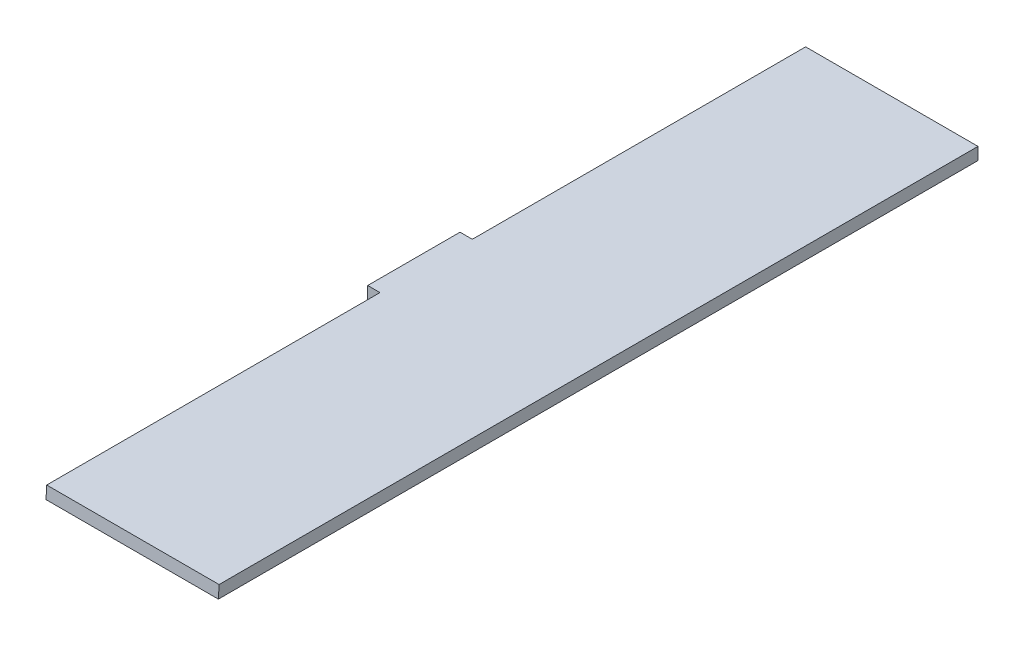
ISO-10303-21;
HEADER;
FILE_DESCRIPTION(('STEP AP214'),'2;1');
FILE_NAME('part.step','',(''),(''),'','','');
FILE_SCHEMA(('AUTOMOTIVE_DESIGN { 1 0 10303 214 1 1 1 1 }'));
ENDSEC;
DATA;
#1=APPLICATION_CONTEXT('core data for automotive mechanical design processes');
#2=APPLICATION_PROTOCOL_DEFINITION('international standard','automotive_design',2000,#1);
#3=PRODUCT_CONTEXT('',#1,'mechanical');
#4=PRODUCT('Part','Part','',(#3));
#5=PRODUCT_RELATED_PRODUCT_CATEGORY('part','',(#4));
#6=PRODUCT_DEFINITION_FORMATION('','',#4);
#7=PRODUCT_DEFINITION_CONTEXT('part definition',#1,'design');
#8=PRODUCT_DEFINITION('design','',#6,#7);
#9=PRODUCT_DEFINITION_SHAPE('','',#8);
#10=(LENGTH_UNIT() NAMED_UNIT(*) SI_UNIT(.MILLI.,.METRE.));
#11=(NAMED_UNIT(*) PLANE_ANGLE_UNIT() SI_UNIT($,.RADIAN.));
#12=(NAMED_UNIT(*) SI_UNIT($,.STERADIAN.) SOLID_ANGLE_UNIT());
#13=UNCERTAINTY_MEASURE_WITH_UNIT(LENGTH_MEASURE(1.E-05),#10,'distance_accuracy_value','');
#14=(GEOMETRIC_REPRESENTATION_CONTEXT(3) GLOBAL_UNCERTAINTY_ASSIGNED_CONTEXT((#13)) GLOBAL_UNIT_ASSIGNED_CONTEXT((#10,
#11,#12)) REPRESENTATION_CONTEXT('',''));
#15=CARTESIAN_POINT('',(0.,0.,0.));
#16=DIRECTION('',(0.,0.,1.));
#17=DIRECTION('',(1.,0.,0.));
#18=AXIS2_PLACEMENT_3D('',#15,#16,#17);
#19=CARTESIAN_POINT('',(-498.,-52.0000000000001,900.));
#20=DIRECTION('',(1.,0.,0.));
#21=DIRECTION('',(0.,0.,-1.));
#22=AXIS2_PLACEMENT_3D('',#19,#20,#21);
#23=PLANE('',#22);
#24=DIRECTION('',(0.,1.,0.));
#25=VECTOR('',#24,1.);
#26=CARTESIAN_POINT('',(-498.,-152.,-104.860222543824));
#27=LINE('',#26,#25);
#28=CARTESIAN_POINT('',(-498.,-152.,-104.860222543824));
#29=VERTEX_POINT('',#28);
#30=CARTESIAN_POINT('',(-498.,-150.,-104.860222543824));
#31=VERTEX_POINT('',#30);
#32=EDGE_CURVE('E139',#29,#31,#27,.T.);
#33=ORIENTED_EDGE('',*,*,#32,.F.);
#34=DIRECTION('',(0.,0.,-1.));
#35=VECTOR('',#34,1.);
#36=CARTESIAN_POINT('',(-498.,-152.,900.));
#37=LINE('',#36,#35);
#38=CARTESIAN_POINT('',(-498.,-152.,-50.6057487484722));
#39=VERTEX_POINT('',#38);
#40=EDGE_CURVE('E11',#39,#29,#37,.T.);
#41=ORIENTED_EDGE('',*,*,#40,.F.);
#42=DIRECTION('',(0.,-0.998359638745861,0.0572540978728565));
#43=VECTOR('',#42,1.);
#44=CARTESIAN_POINT('',(-498.,-106.664599325717,-53.2056509946921));
#45=LINE('',#44,#43);
#46=CARTESIAN_POINT('',(-498.,-150.,-50.7204450876487));
#47=VERTEX_POINT('',#46);
#48=EDGE_CURVE('E157',#47,#39,#45,.T.);
#49=ORIENTED_EDGE('',*,*,#48,.F.);
#50=DIRECTION('',(0.,0.,-1.));
#51=VECTOR('',#50,1.);
#52=CARTESIAN_POINT('',(-498.,-150.,-149.));
#53=LINE('',#52,#51);
#54=EDGE_CURVE('E46',#47,#31,#53,.T.);
#55=ORIENTED_EDGE('',*,*,#54,.T.);
#56=EDGE_LOOP('',(#33,#41,#49,#55));
#57=FACE_BOUND('',#56,.T.);
#58=ADVANCED_FACE('F42',(#57),#23,.F.);
#59=CARTESIAN_POINT('',(-498.,-152.,-119.860222543824));
#60=VERTEX_POINT('',#59);
#61=CARTESIAN_POINT('',(-498.,-152.,-174.));
#62=VERTEX_POINT('',#61);
#63=EDGE_CURVE('E51',#60,#62,#37,.T.);
#64=ORIENTED_EDGE('',*,*,#63,.F.);
#65=DIRECTION('',(0.,1.,0.));
#66=VECTOR('',#65,1.);
#67=CARTESIAN_POINT('',(-498.,-152.,-119.860222543824));
#68=LINE('',#67,#66);
#69=CARTESIAN_POINT('',(-498.,-150.,-119.860222543824));
#70=VERTEX_POINT('',#69);
#71=EDGE_CURVE('E128',#60,#70,#68,.T.);
#72=ORIENTED_EDGE('',*,*,#71,.T.);
#73=CARTESIAN_POINT('',(-498.,-150.,-174.));
#74=VERTEX_POINT('',#73);
#75=EDGE_CURVE('E165',#70,#74,#53,.T.);
#76=ORIENTED_EDGE('',*,*,#75,.T.);
#77=DIRECTION('',(0.,-1.,0.));
#78=VECTOR('',#77,1.);
#79=CARTESIAN_POINT('',(-498.,-203.,-174.));
#80=LINE('',#79,#78);
#81=EDGE_CURVE('E145',#74,#62,#80,.T.);
#82=ORIENTED_EDGE('',*,*,#81,.T.);
#83=EDGE_LOOP('',(#64,#72,#76,#82));
#84=FACE_BOUND('',#83,.T.);
#85=ADVANCED_FACE('F174',(#84),#23,.F.);
#86=CARTESIAN_POINT('',(-500.01,-150.,-50.7204450876487));
#87=DIRECTION('',(0.,0.0572540978728565,0.998359638745861));
#88=DIRECTION('',(0.,-0.998359638745861,0.0572540978728565));
#89=AXIS2_PLACEMENT_3D('',#86,#87,#88);
#90=PLANE('',#89);
#91=DIRECTION('',(-1.,0.,0.));
#92=VECTOR('',#91,1.);
#93=CARTESIAN_POINT('',(-498.,-150.,-50.7204450876487));
#94=LINE('',#93,#92);
#95=CARTESIAN_POINT('',(-470.,-150.,-50.7204450876487));
#96=VERTEX_POINT('',#95);
#97=EDGE_CURVE('E138',#96,#47,#94,.T.);
#98=ORIENTED_EDGE('',*,*,#97,.T.);
#99=ORIENTED_EDGE('',*,*,#48,.T.);
#100=DIRECTION('',(-1.,0.,0.));
#101=VECTOR('',#100,1.);
#102=CARTESIAN_POINT('',(-470.,-152.,-50.6057487484722));
#103=LINE('',#102,#101);
#104=CARTESIAN_POINT('',(-470.,-152.,-50.6057487484722));
#105=VERTEX_POINT('',#104);
#106=EDGE_CURVE('E152',#105,#39,#103,.T.);
#107=ORIENTED_EDGE('',*,*,#106,.F.);
#108=DIRECTION('',(0.,-0.998359638745861,0.0572540978728565));
#109=VECTOR('',#108,1.);
#110=CARTESIAN_POINT('',(-470.,-3.39089455316651,-59.1282089299946));
#111=LINE('',#110,#109);
#112=EDGE_CURVE('E144',#96,#105,#111,.T.);
#113=ORIENTED_EDGE('',*,*,#112,.F.);
#114=EDGE_LOOP('',(#98,#99,#107,#113));
#115=FACE_BOUND('',#114,.T.);
#116=ADVANCED_FACE('F183',(#115),#90,.T.);
#117=CARTESIAN_POINT('',(-500.01,-152.,-169.390030623607));
#118=DIRECTION('',(0.,-1.,0.));
#119=DIRECTION('',(0.,0.,-1.));
#120=AXIS2_PLACEMENT_3D('',#117,#118,#119);
#121=PLANE('',#120);
#122=DIRECTION('',(-1.,0.,0.));
#123=VECTOR('',#122,1.);
#124=CARTESIAN_POINT('',(-498.,-152.,-174.));
#125=LINE('',#124,#123);
#126=CARTESIAN_POINT('',(-470.,-152.,-174.));
#127=VERTEX_POINT('',#126);
#128=EDGE_CURVE('E142',#127,#62,#125,.T.);
#129=ORIENTED_EDGE('',*,*,#128,.F.);
#130=DIRECTION('',(0.,0.,-1.));
#131=VECTOR('',#130,1.);
#132=CARTESIAN_POINT('',(-470.,-152.,-50.7204450876487));
#133=LINE('',#132,#131);
#134=EDGE_CURVE('E153',#105,#127,#133,.T.);
#135=ORIENTED_EDGE('',*,*,#134,.F.);
#136=ORIENTED_EDGE('',*,*,#106,.T.);
#137=ORIENTED_EDGE('',*,*,#40,.T.);
#138=DIRECTION('',(1.,0.,0.));
#139=VECTOR('',#138,1.);
#140=CARTESIAN_POINT('',(-498.,-152.,-104.860222543824));
#141=LINE('',#140,#139);
#142=CARTESIAN_POINT('',(-500.,-152.,-104.860222543824));
#143=VERTEX_POINT('',#142);
#144=EDGE_CURVE('E117',#143,#29,#141,.T.);
#145=ORIENTED_EDGE('',*,*,#144,.F.);
#146=DIRECTION('',(0.,0.,1.));
#147=VECTOR('',#146,1.);
#148=CARTESIAN_POINT('',(-500.,-152.,-119.860222543824));
#149=LINE('',#148,#147);
#150=CARTESIAN_POINT('',(-500.,-152.,-119.860222543824));
#151=VERTEX_POINT('',#150);
#152=EDGE_CURVE('E112',#151,#143,#149,.T.);
#153=ORIENTED_EDGE('',*,*,#152,.F.);
#154=DIRECTION('',(-1.,0.,0.));
#155=VECTOR('',#154,1.);
#156=CARTESIAN_POINT('',(-498.,-152.,-119.860222543824));
#157=LINE('',#156,#155);
#158=EDGE_CURVE('E124',#60,#151,#157,.T.);
#159=ORIENTED_EDGE('',*,*,#158,.F.);
#160=ORIENTED_EDGE('',*,*,#63,.T.);
#161=EDGE_LOOP('',(#129,#135,#136,#137,#145,#153,#159,#160));
#162=FACE_BOUND('',#161,.T.);
#163=ADVANCED_FACE('F123',(#162),#121,.T.);
#164=CARTESIAN_POINT('',(-498.,-203.,-174.));
#165=DIRECTION('',(0.,0.,-1.));
#166=DIRECTION('',(-1.,0.,0.));
#167=AXIS2_PLACEMENT_3D('',#164,#165,#166);
#168=PLANE('',#167);
#169=DIRECTION('',(0.,-1.,0.));
#170=VECTOR('',#169,1.);
#171=CARTESIAN_POINT('',(-470.,-150.,-174.));
#172=LINE('',#171,#170);
#173=CARTESIAN_POINT('',(-470.,-150.,-174.));
#174=VERTEX_POINT('',#173);
#175=EDGE_CURVE('E67',#174,#127,#172,.T.);
#176=ORIENTED_EDGE('',*,*,#175,.T.);
#177=ORIENTED_EDGE('',*,*,#128,.T.);
#178=ORIENTED_EDGE('',*,*,#81,.F.);
#179=DIRECTION('',(-1.,0.,0.));
#180=VECTOR('',#179,1.);
#181=CARTESIAN_POINT('',(-498.,-150.,-174.));
#182=LINE('',#181,#180);
#183=EDGE_CURVE('E147',#174,#74,#182,.T.);
#184=ORIENTED_EDGE('',*,*,#183,.F.);
#185=EDGE_LOOP('',(#176,#177,#178,#184));
#186=FACE_BOUND('',#185,.T.);
#187=ADVANCED_FACE('F177',(#186),#168,.T.);
#188=CARTESIAN_POINT('',(-470.,0.,0.));
#189=DIRECTION('',(1.,0.,0.));
#190=DIRECTION('',(0.,0.,-1.));
#191=AXIS2_PLACEMENT_3D('',#188,#189,#190);
#192=PLANE('',#191);
#193=ORIENTED_EDGE('',*,*,#134,.T.);
#194=ORIENTED_EDGE('',*,*,#175,.F.);
#195=DIRECTION('',(0.,0.,-1.));
#196=VECTOR('',#195,1.);
#197=CARTESIAN_POINT('',(-470.,-150.,-50.7204450876487));
#198=LINE('',#197,#196);
#199=EDGE_CURVE('E150',#96,#174,#198,.T.);
#200=ORIENTED_EDGE('',*,*,#199,.F.);
#201=ORIENTED_EDGE('',*,*,#112,.T.);
#202=EDGE_LOOP('',(#193,#194,#200,#201));
#203=FACE_BOUND('',#202,.T.);
#204=ADVANCED_FACE('F44',(#203),#192,.T.);
#205=CARTESIAN_POINT('',(-498.,-150.,-149.));
#206=DIRECTION('',(0.,1.,0.));
#207=DIRECTION('',(0.,0.,1.));
#208=AXIS2_PLACEMENT_3D('',#205,#206,#207);
#209=PLANE('',#208);
#210=ORIENTED_EDGE('',*,*,#54,.F.);
#211=ORIENTED_EDGE('',*,*,#97,.F.);
#212=ORIENTED_EDGE('',*,*,#199,.T.);
#213=ORIENTED_EDGE('',*,*,#183,.T.);
#214=ORIENTED_EDGE('',*,*,#75,.F.);
#215=DIRECTION('',(-1.,0.,0.));
#216=VECTOR('',#215,1.);
#217=CARTESIAN_POINT('',(-498.,-150.,-119.860222543824));
#218=LINE('',#217,#216);
#219=CARTESIAN_POINT('',(-500.,-150.,-119.860222543824));
#220=VERTEX_POINT('',#219);
#221=EDGE_CURVE('E59',#70,#220,#218,.T.);
#222=ORIENTED_EDGE('',*,*,#221,.T.);
#223=DIRECTION('',(0.,0.,1.));
#224=VECTOR('',#223,1.);
#225=CARTESIAN_POINT('',(-500.,-150.,-119.860222543824));
#226=LINE('',#225,#224);
#227=CARTESIAN_POINT('',(-500.,-150.,-104.860222543824));
#228=VERTEX_POINT('',#227);
#229=EDGE_CURVE('E114',#220,#228,#226,.T.);
#230=ORIENTED_EDGE('',*,*,#229,.T.);
#231=DIRECTION('',(1.,0.,0.));
#232=VECTOR('',#231,1.);
#233=CARTESIAN_POINT('',(-498.,-150.,-104.860222543824));
#234=LINE('',#233,#232);
#235=EDGE_CURVE('E129',#228,#31,#234,.T.);
#236=ORIENTED_EDGE('',*,*,#235,.T.);
#237=EDGE_LOOP('',(#210,#211,#212,#213,#214,#222,#230,#236));
#238=FACE_BOUND('',#237,.T.);
#239=ADVANCED_FACE('F178',(#238),#209,.T.);
#240=CARTESIAN_POINT('',(-498.,-152.,-119.860222543824));
#241=DIRECTION('',(0.,0.,-1.));
#242=DIRECTION('',(-1.,0.,0.));
#243=AXIS2_PLACEMENT_3D('',#240,#241,#242);
#244=PLANE('',#243);
#245=ORIENTED_EDGE('',*,*,#221,.F.);
#246=ORIENTED_EDGE('',*,*,#71,.F.);
#247=ORIENTED_EDGE('',*,*,#158,.T.);
#248=DIRECTION('',(0.,1.,0.));
#249=VECTOR('',#248,1.);
#250=CARTESIAN_POINT('',(-500.,-152.,-119.860222543824));
#251=LINE('',#250,#249);
#252=EDGE_CURVE('E109',#151,#220,#251,.T.);
#253=ORIENTED_EDGE('',*,*,#252,.T.);
#254=EDGE_LOOP('',(#245,#246,#247,#253));
#255=FACE_BOUND('',#254,.T.);
#256=ADVANCED_FACE('F127',(#255),#244,.T.);
#257=CARTESIAN_POINT('',(-498.,-152.,-104.860222543824));
#258=DIRECTION('',(0.,0.,1.));
#259=DIRECTION('',(1.,0.,0.));
#260=AXIS2_PLACEMENT_3D('',#257,#258,#259);
#261=PLANE('',#260);
#262=ORIENTED_EDGE('',*,*,#235,.F.);
#263=DIRECTION('',(0.,1.,0.));
#264=VECTOR('',#263,1.);
#265=CARTESIAN_POINT('',(-500.,-152.,-104.860222543824));
#266=LINE('',#265,#264);
#267=EDGE_CURVE('E116',#143,#228,#266,.T.);
#268=ORIENTED_EDGE('',*,*,#267,.F.);
#269=ORIENTED_EDGE('',*,*,#144,.T.);
#270=ORIENTED_EDGE('',*,*,#32,.T.);
#271=EDGE_LOOP('',(#262,#268,#269,#270));
#272=FACE_BOUND('',#271,.T.);
#273=ADVANCED_FACE('F186',(#272),#261,.T.);
#274=CARTESIAN_POINT('',(-500.,-152.,-119.860222543824));
#275=DIRECTION('',(-1.,0.,0.));
#276=DIRECTION('',(0.,0.,1.));
#277=AXIS2_PLACEMENT_3D('',#274,#275,#276);
#278=PLANE('',#277);
#279=ORIENTED_EDGE('',*,*,#229,.F.);
#280=ORIENTED_EDGE('',*,*,#252,.F.);
#281=ORIENTED_EDGE('',*,*,#152,.T.);
#282=ORIENTED_EDGE('',*,*,#267,.T.);
#283=EDGE_LOOP('',(#279,#280,#281,#282));
#284=FACE_BOUND('',#283,.T.);
#285=ADVANCED_FACE('F111',(#284),#278,.T.);
#286=CLOSED_SHELL('',(#58,#85,#116,#163,#187,#204,#239,#256,#273,#285));
#287=MANIFOLD_SOLID_BREP('B2',#286);
#288=ADVANCED_BREP_SHAPE_REPRESENTATION('',(#18,#287),#14);
#289=SHAPE_DEFINITION_REPRESENTATION(#9,#288);
ENDSEC;
END-ISO-10303-21;
